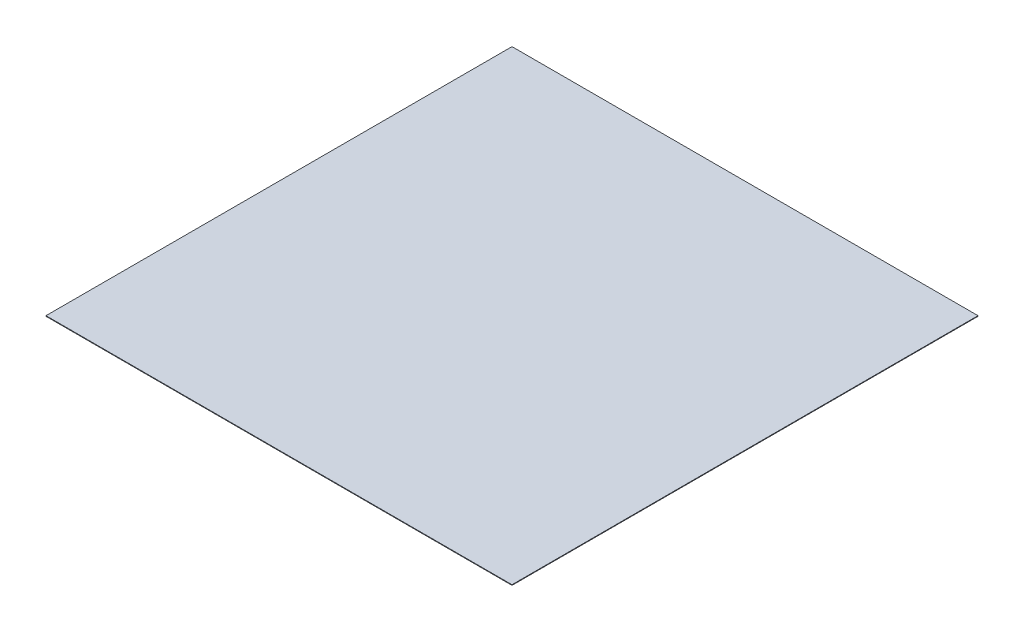
ISO-10303-21;
HEADER;
FILE_DESCRIPTION(('STEP AP214'),'2;1');
FILE_NAME('part.step','',(''),(''),'','','');
FILE_SCHEMA(('AUTOMOTIVE_DESIGN { 1 0 10303 214 1 1 1 1 }'));
ENDSEC;
DATA;
#1=APPLICATION_CONTEXT('core data for automotive mechanical design processes');
#2=APPLICATION_PROTOCOL_DEFINITION('international standard','automotive_design',2000,#1);
#3=PRODUCT_CONTEXT('',#1,'mechanical');
#4=PRODUCT('Part','Part','',(#3));
#5=PRODUCT_RELATED_PRODUCT_CATEGORY('part','',(#4));
#6=PRODUCT_DEFINITION_FORMATION('','',#4);
#7=PRODUCT_DEFINITION_CONTEXT('part definition',#1,'design');
#8=PRODUCT_DEFINITION('design','',#6,#7);
#9=PRODUCT_DEFINITION_SHAPE('','',#8);
#10=(LENGTH_UNIT() NAMED_UNIT(*) SI_UNIT(.MILLI.,.METRE.));
#11=(NAMED_UNIT(*) PLANE_ANGLE_UNIT() SI_UNIT($,.RADIAN.));
#12=(NAMED_UNIT(*) SI_UNIT($,.STERADIAN.) SOLID_ANGLE_UNIT());
#13=UNCERTAINTY_MEASURE_WITH_UNIT(LENGTH_MEASURE(1.E-05),#10,'distance_accuracy_value','');
#14=(GEOMETRIC_REPRESENTATION_CONTEXT(3) GLOBAL_UNCERTAINTY_ASSIGNED_CONTEXT((#13)) GLOBAL_UNIT_ASSIGNED_CONTEXT((#10,
#11,#12)) REPRESENTATION_CONTEXT('',''));
#15=CARTESIAN_POINT('',(0.,0.,0.));
#16=DIRECTION('',(0.,0.,1.));
#17=DIRECTION('',(1.,0.,0.));
#18=AXIS2_PLACEMENT_3D('',#15,#16,#17);
#19=CARTESIAN_POINT('',(400.,1.,400.));
#20=DIRECTION('',(-1.,0.,0.));
#21=DIRECTION('',(0.,0.,1.));
#22=AXIS2_PLACEMENT_3D('',#19,#20,#21);
#23=PLANE('',#22);
#24=DIRECTION('',(0.,0.,-1.));
#25=VECTOR('',#24,1.);
#26=CARTESIAN_POINT('',(400.,0.,400.));
#27=LINE('',#26,#25);
#28=CARTESIAN_POINT('',(400.,0.,400.));
#29=VERTEX_POINT('',#28);
#30=CARTESIAN_POINT('',(400.,0.,-400.));
#31=VERTEX_POINT('',#30);
#32=EDGE_CURVE('E98',#29,#31,#27,.T.);
#33=ORIENTED_EDGE('',*,*,#32,.T.);
#34=DIRECTION('',(0.,-1.,0.));
#35=VECTOR('',#34,1.);
#36=CARTESIAN_POINT('',(400.,1.,-400.));
#37=LINE('',#36,#35);
#38=CARTESIAN_POINT('',(400.,1.,-400.));
#39=VERTEX_POINT('',#38);
#40=EDGE_CURVE('E11',#39,#31,#37,.T.);
#41=ORIENTED_EDGE('',*,*,#40,.F.);
#42=DIRECTION('',(0.,0.,-1.));
#43=VECTOR('',#42,1.);
#44=CARTESIAN_POINT('',(400.,1.,400.));
#45=LINE('',#44,#43);
#46=CARTESIAN_POINT('',(400.,1.,400.));
#47=VERTEX_POINT('',#46);
#48=EDGE_CURVE('E86',#47,#39,#45,.T.);
#49=ORIENTED_EDGE('',*,*,#48,.F.);
#50=DIRECTION('',(0.,-1.,0.));
#51=VECTOR('',#50,1.);
#52=CARTESIAN_POINT('',(400.,1.,400.));
#53=LINE('',#52,#51);
#54=EDGE_CURVE('E94',#47,#29,#53,.T.);
#55=ORIENTED_EDGE('',*,*,#54,.T.);
#56=EDGE_LOOP('',(#33,#41,#49,#55));
#57=FACE_BOUND('',#56,.T.);
#58=ADVANCED_FACE('F35',(#57),#23,.F.);
#59=CARTESIAN_POINT('',(-400.,1.,-400.));
#60=DIRECTION('',(0.,0.,1.));
#61=DIRECTION('',(1.,0.,0.));
#62=AXIS2_PLACEMENT_3D('',#59,#60,#61);
#63=PLANE('',#62);
#64=DIRECTION('',(-1.,0.,0.));
#65=VECTOR('',#64,1.);
#66=CARTESIAN_POINT('',(-400.,0.,-400.));
#67=LINE('',#66,#65);
#68=CARTESIAN_POINT('',(-400.,0.,-400.));
#69=VERTEX_POINT('',#68);
#70=EDGE_CURVE('E90',#31,#69,#67,.T.);
#71=ORIENTED_EDGE('',*,*,#70,.T.);
#72=DIRECTION('',(0.,-1.,0.));
#73=VECTOR('',#72,1.);
#74=CARTESIAN_POINT('',(-400.,1.,-400.));
#75=LINE('',#74,#73);
#76=CARTESIAN_POINT('',(-400.,1.,-400.));
#77=VERTEX_POINT('',#76);
#78=EDGE_CURVE('E43',#77,#69,#75,.T.);
#79=ORIENTED_EDGE('',*,*,#78,.F.);
#80=DIRECTION('',(-1.,0.,0.));
#81=VECTOR('',#80,1.);
#82=CARTESIAN_POINT('',(-400.,1.,-400.));
#83=LINE('',#82,#81);
#84=EDGE_CURVE('E81',#39,#77,#83,.T.);
#85=ORIENTED_EDGE('',*,*,#84,.F.);
#86=ORIENTED_EDGE('',*,*,#40,.T.);
#87=EDGE_LOOP('',(#71,#79,#85,#86));
#88=FACE_BOUND('',#87,.T.);
#89=ADVANCED_FACE('F89',(#88),#63,.F.);
#90=CARTESIAN_POINT('',(-400.,1.,400.));
#91=DIRECTION('',(1.,0.,0.));
#92=DIRECTION('',(0.,0.,-1.));
#93=AXIS2_PLACEMENT_3D('',#90,#91,#92);
#94=PLANE('',#93);
#95=DIRECTION('',(0.,0.,1.));
#96=VECTOR('',#95,1.);
#97=CARTESIAN_POINT('',(-400.,0.,400.));
#98=LINE('',#97,#96);
#99=CARTESIAN_POINT('',(-400.,0.,400.));
#100=VERTEX_POINT('',#99);
#101=EDGE_CURVE('E68',#69,#100,#98,.T.);
#102=ORIENTED_EDGE('',*,*,#101,.T.);
#103=DIRECTION('',(0.,-1.,0.));
#104=VECTOR('',#103,1.);
#105=CARTESIAN_POINT('',(-400.,1.,400.));
#106=LINE('',#105,#104);
#107=CARTESIAN_POINT('',(-400.,1.,400.));
#108=VERTEX_POINT('',#107);
#109=EDGE_CURVE('E91',#108,#100,#106,.T.);
#110=ORIENTED_EDGE('',*,*,#109,.F.);
#111=DIRECTION('',(0.,0.,1.));
#112=VECTOR('',#111,1.);
#113=CARTESIAN_POINT('',(-400.,1.,400.));
#114=LINE('',#113,#112);
#115=EDGE_CURVE('E84',#77,#108,#114,.T.);
#116=ORIENTED_EDGE('',*,*,#115,.F.);
#117=ORIENTED_EDGE('',*,*,#78,.T.);
#118=EDGE_LOOP('',(#102,#110,#116,#117));
#119=FACE_BOUND('',#118,.T.);
#120=ADVANCED_FACE('F92',(#119),#94,.F.);
#121=CARTESIAN_POINT('',(-400.,1.,400.));
#122=DIRECTION('',(0.,0.,-1.));
#123=DIRECTION('',(-1.,0.,0.));
#124=AXIS2_PLACEMENT_3D('',#121,#122,#123);
#125=PLANE('',#124);
#126=DIRECTION('',(1.,0.,0.));
#127=VECTOR('',#126,1.);
#128=CARTESIAN_POINT('',(-400.,0.,400.));
#129=LINE('',#128,#127);
#130=EDGE_CURVE('E74',#100,#29,#129,.T.);
#131=ORIENTED_EDGE('',*,*,#130,.T.);
#132=ORIENTED_EDGE('',*,*,#54,.F.);
#133=DIRECTION('',(1.,0.,0.));
#134=VECTOR('',#133,1.);
#135=CARTESIAN_POINT('',(-400.,1.,400.));
#136=LINE('',#135,#134);
#137=EDGE_CURVE('E51',#108,#47,#136,.T.);
#138=ORIENTED_EDGE('',*,*,#137,.F.);
#139=ORIENTED_EDGE('',*,*,#109,.T.);
#140=EDGE_LOOP('',(#131,#132,#138,#139));
#141=FACE_BOUND('',#140,.T.);
#142=ADVANCED_FACE('F105',(#141),#125,.F.);
#143=CARTESIAN_POINT('',(0.,1.,0.));
#144=DIRECTION('',(0.,-1.,0.));
#145=DIRECTION('',(0.,0.,-1.));
#146=AXIS2_PLACEMENT_3D('',#143,#144,#145);
#147=PLANE('',#146);
#148=ORIENTED_EDGE('',*,*,#48,.T.);
#149=ORIENTED_EDGE('',*,*,#84,.T.);
#150=ORIENTED_EDGE('',*,*,#115,.T.);
#151=ORIENTED_EDGE('',*,*,#137,.T.);
#152=EDGE_LOOP('',(#148,#149,#150,#151));
#153=FACE_BOUND('',#152,.T.);
#154=ADVANCED_FACE('F82',(#153),#147,.F.);
#155=CARTESIAN_POINT('',(0.,0.,0.));
#156=DIRECTION('',(0.,-1.,0.));
#157=DIRECTION('',(0.,0.,-1.));
#158=AXIS2_PLACEMENT_3D('',#155,#156,#157);
#159=PLANE('',#158);
#160=ORIENTED_EDGE('',*,*,#32,.F.);
#161=ORIENTED_EDGE('',*,*,#130,.F.);
#162=ORIENTED_EDGE('',*,*,#101,.F.);
#163=ORIENTED_EDGE('',*,*,#70,.F.);
#164=EDGE_LOOP('',(#160,#161,#162,#163));
#165=FACE_BOUND('',#164,.T.);
#166=ADVANCED_FACE('F108',(#165),#159,.T.);
#167=CLOSED_SHELL('',(#58,#89,#120,#142,#154,#166));
#168=MANIFOLD_SOLID_BREP('B2',#167);
#169=ADVANCED_BREP_SHAPE_REPRESENTATION('',(#18,#168),#14);
#170=SHAPE_DEFINITION_REPRESENTATION(#9,#169);
ENDSEC;
END-ISO-10303-21;
